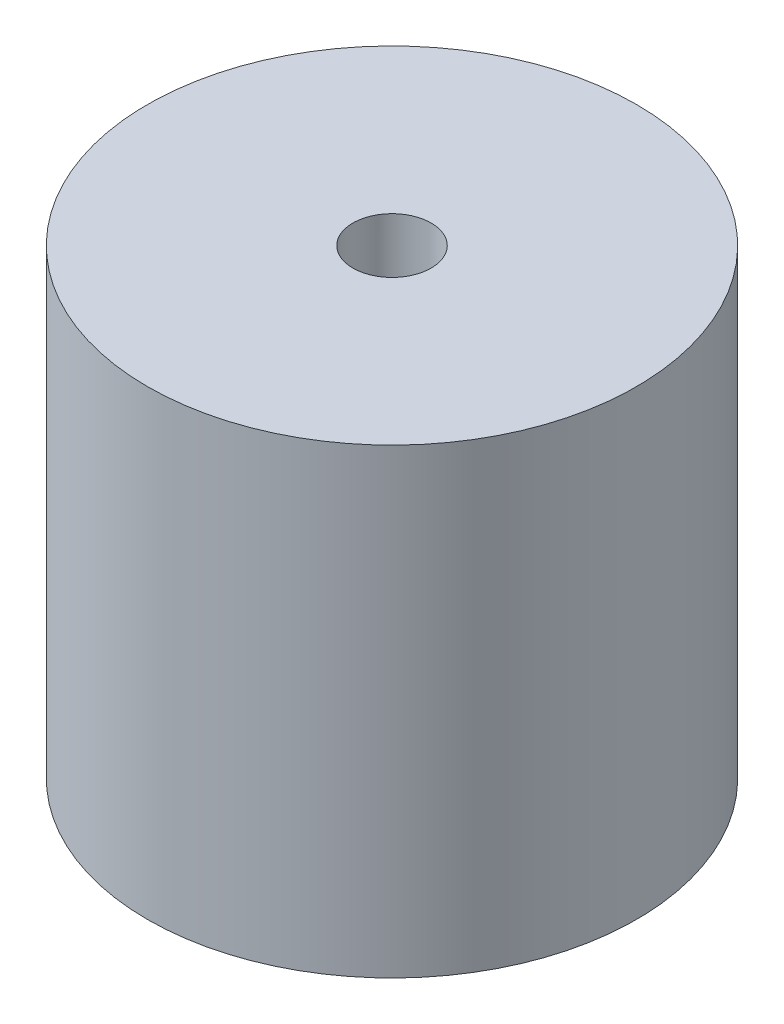
ISO-10303-21;
HEADER;
FILE_DESCRIPTION(('STEP AP214'),'2;1');
FILE_NAME('part.step','',(''),(''),'','','');
FILE_SCHEMA(('AUTOMOTIVE_DESIGN { 1 0 10303 214 1 1 1 1 }'));
ENDSEC;
DATA;
#1=APPLICATION_CONTEXT('core data for automotive mechanical design processes');
#2=APPLICATION_PROTOCOL_DEFINITION('international standard','automotive_design',2000,#1);
#3=PRODUCT_CONTEXT('',#1,'mechanical');
#4=PRODUCT('Part','Part','',(#3));
#5=PRODUCT_RELATED_PRODUCT_CATEGORY('part','',(#4));
#6=PRODUCT_DEFINITION_FORMATION('','',#4);
#7=PRODUCT_DEFINITION_CONTEXT('part definition',#1,'design');
#8=PRODUCT_DEFINITION('design','',#6,#7);
#9=PRODUCT_DEFINITION_SHAPE('','',#8);
#10=(LENGTH_UNIT() NAMED_UNIT(*) SI_UNIT(.MILLI.,.METRE.));
#11=(NAMED_UNIT(*) PLANE_ANGLE_UNIT() SI_UNIT($,.RADIAN.));
#12=(NAMED_UNIT(*) SI_UNIT($,.STERADIAN.) SOLID_ANGLE_UNIT());
#13=UNCERTAINTY_MEASURE_WITH_UNIT(LENGTH_MEASURE(1.E-05),#10,'distance_accuracy_value','');
#14=(GEOMETRIC_REPRESENTATION_CONTEXT(3) GLOBAL_UNCERTAINTY_ASSIGNED_CONTEXT((#13)) GLOBAL_UNIT_ASSIGNED_CONTEXT((#10,
#11,#12)) REPRESENTATION_CONTEXT('',''));
#15=CARTESIAN_POINT('',(0.,0.,0.));
#16=DIRECTION('',(0.,0.,1.));
#17=DIRECTION('',(1.,0.,0.));
#18=AXIS2_PLACEMENT_3D('',#15,#16,#17);
#19=CARTESIAN_POINT('',(0.,29.972,0.));
#20=DIRECTION('',(0.,-1.,0.));
#21=DIRECTION('',(0.,0.,-1.));
#22=AXIS2_PLACEMENT_3D('',#19,#20,#21);
#23=CYLINDRICAL_SURFACE('',#22,15.875);
#24=CARTESIAN_POINT('',(0.,29.972,0.));
#25=DIRECTION('',(0.,1.,0.));
#26=DIRECTION('',(0.,0.,1.));
#27=AXIS2_PLACEMENT_3D('',#24,#25,#26);
#28=CIRCLE('',#27,15.875);
#29=CARTESIAN_POINT('',(0.,29.972,15.875));
#30=VERTEX_POINT('',#29);
#31=EDGE_CURVE('E10',#30,#30,#28,.T.);
#32=ORIENTED_EDGE('',*,*,#31,.F.);
#33=EDGE_LOOP('',(#32));
#34=FACE_BOUND('',#33,.T.);
#35=CARTESIAN_POINT('',(0.,0.,0.));
#36=DIRECTION('',(0.,1.,0.));
#37=DIRECTION('',(0.,0.,1.));
#38=AXIS2_PLACEMENT_3D('',#35,#36,#37);
#39=CIRCLE('',#38,15.875);
#40=CARTESIAN_POINT('',(0.,0.,15.875));
#41=VERTEX_POINT('',#40);
#42=EDGE_CURVE('E34',#41,#41,#39,.T.);
#43=ORIENTED_EDGE('',*,*,#42,.T.);
#44=EDGE_LOOP('',(#43));
#45=FACE_BOUND('',#44,.T.);
#46=ADVANCED_FACE('F31',(#34,#45),#23,.T.);
#47=CARTESIAN_POINT('',(0.,29.972,0.));
#48=DIRECTION('',(0.,1.,0.));
#49=DIRECTION('',(0.,0.,1.));
#50=AXIS2_PLACEMENT_3D('',#47,#48,#49);
#51=PLANE('',#50);
#52=CARTESIAN_POINT('',(0.,29.972,0.));
#53=DIRECTION('',(0.,1.,0.));
#54=DIRECTION('',(0.,0.,1.));
#55=AXIS2_PLACEMENT_3D('',#52,#53,#54);
#56=CIRCLE('',#55,2.54);
#57=CARTESIAN_POINT('',(0.,29.972,2.54));
#58=VERTEX_POINT('',#57);
#59=EDGE_CURVE('E46',#58,#58,#56,.T.);
#60=ORIENTED_EDGE('',*,*,#59,.F.);
#61=EDGE_LOOP('',(#60));
#62=FACE_BOUND('',#61,.T.);
#63=ORIENTED_EDGE('',*,*,#31,.T.);
#64=EDGE_LOOP('',(#63));
#65=FACE_BOUND('',#64,.T.);
#66=ADVANCED_FACE('F57',(#62,#65),#51,.T.);
#67=CARTESIAN_POINT('',(0.,0.,0.));
#68=DIRECTION('',(0.,1.,0.));
#69=DIRECTION('',(0.,0.,1.));
#70=AXIS2_PLACEMENT_3D('',#67,#68,#69);
#71=PLANE('',#70);
#72=CARTESIAN_POINT('',(0.,0.,0.));
#73=DIRECTION('',(0.,-1.,0.));
#74=DIRECTION('',(0.,0.,-1.));
#75=AXIS2_PLACEMENT_3D('',#72,#73,#74);
#76=CIRCLE('',#75,12.065);
#77=CARTESIAN_POINT('',(0.,0.,-12.065));
#78=VERTEX_POINT('',#77);
#79=EDGE_CURVE('E43',#78,#78,#76,.T.);
#80=ORIENTED_EDGE('',*,*,#79,.F.);
#81=EDGE_LOOP('',(#80));
#82=FACE_BOUND('',#81,.T.);
#83=ORIENTED_EDGE('',*,*,#42,.F.);
#84=EDGE_LOOP('',(#83));
#85=FACE_BOUND('',#84,.T.);
#86=ADVANCED_FACE('F59',(#82,#85),#71,.F.);
#87=CARTESIAN_POINT('',(0.,24.13,0.));
#88=DIRECTION('',(0.,-1.,0.));
#89=DIRECTION('',(0.,0.,-1.));
#90=AXIS2_PLACEMENT_3D('',#87,#88,#89);
#91=CYLINDRICAL_SURFACE('',#90,12.065);
#92=CARTESIAN_POINT('',(0.,24.13,0.));
#93=DIRECTION('',(0.,-1.,0.));
#94=DIRECTION('',(0.,0.,-1.));
#95=AXIS2_PLACEMENT_3D('',#92,#93,#94);
#96=CIRCLE('',#95,12.065);
#97=CARTESIAN_POINT('',(0.,24.13,-12.065));
#98=VERTEX_POINT('',#97);
#99=EDGE_CURVE('E41',#98,#98,#96,.T.);
#100=CARTESIAN_POINT('',(0.,24.13,-12.065));
#101=CARTESIAN_POINT('',(0.,23.8786458333333,-12.065));
#102=CARTESIAN_POINT('',(0.,23.6272916666667,-12.065));
#103=CARTESIAN_POINT('',(0.,23.1245833333333,-12.065));
#104=CARTESIAN_POINT('',(0.,22.8732291666667,-12.065));
#105=CARTESIAN_POINT('',(0.,22.3705208333333,-12.065));
#106=CARTESIAN_POINT('',(0.,22.1191666666667,-12.065));
#107=CARTESIAN_POINT('',(0.,21.6164583333333,-12.065));
#108=CARTESIAN_POINT('',(0.,21.3651041666667,-12.065));
#109=CARTESIAN_POINT('',(0.,20.8623958333333,-12.065));
#110=CARTESIAN_POINT('',(0.,20.6110416666667,-12.065));
#111=CARTESIAN_POINT('',(0.,20.1083333333333,-12.065));
#112=CARTESIAN_POINT('',(0.,19.8569791666667,-12.065));
#113=CARTESIAN_POINT('',(0.,19.3542708333333,-12.065));
#114=CARTESIAN_POINT('',(0.,19.1029166666667,-12.065));
#115=CARTESIAN_POINT('',(0.,18.6002083333333,-12.065));
#116=CARTESIAN_POINT('',(0.,18.3488541666667,-12.065));
#117=CARTESIAN_POINT('',(0.,17.8461458333333,-12.065));
#118=CARTESIAN_POINT('',(0.,17.5947916666667,-12.065));
#119=CARTESIAN_POINT('',(0.,17.0920833333333,-12.065));
#120=CARTESIAN_POINT('',(0.,16.8407291666667,-12.065));
#121=CARTESIAN_POINT('',(0.,16.3380208333333,-12.065));
#122=CARTESIAN_POINT('',(0.,16.0866666666667,-12.065));
#123=CARTESIAN_POINT('',(0.,15.5839583333333,-12.065));
#124=CARTESIAN_POINT('',(0.,15.3326041666667,-12.065));
#125=CARTESIAN_POINT('',(0.,14.8298958333333,-12.065));
#126=CARTESIAN_POINT('',(0.,14.5785416666667,-12.065));
#127=CARTESIAN_POINT('',(0.,14.0758333333333,-12.065));
#128=CARTESIAN_POINT('',(0.,13.8244791666667,-12.065));
#129=CARTESIAN_POINT('',(0.,13.3217708333333,-12.065));
#130=CARTESIAN_POINT('',(0.,13.0704166666667,-12.065));
#131=CARTESIAN_POINT('',(0.,12.5677083333333,-12.065));
#132=CARTESIAN_POINT('',(0.,12.3163541666667,-12.065));
#133=CARTESIAN_POINT('',(0.,11.8136458333333,-12.065));
#134=CARTESIAN_POINT('',(0.,11.5622916666667,-12.065));
#135=CARTESIAN_POINT('',(0.,11.0595833333333,-12.065));
#136=CARTESIAN_POINT('',(0.,10.8082291666667,-12.065));
#137=CARTESIAN_POINT('',(0.,10.3055208333333,-12.065));
#138=CARTESIAN_POINT('',(0.,10.0541666666667,-12.065));
#139=CARTESIAN_POINT('',(0.,9.55145833333333,-12.065));
#140=CARTESIAN_POINT('',(0.,9.30010416666667,-12.065));
#141=CARTESIAN_POINT('',(0.,8.79739583333334,-12.065));
#142=CARTESIAN_POINT('',(0.,8.54604166666667,-12.065));
#143=CARTESIAN_POINT('',(0.,8.04333333333334,-12.065));
#144=CARTESIAN_POINT('',(0.,7.79197916666667,-12.065));
#145=CARTESIAN_POINT('',(0.,7.28927083333334,-12.065));
#146=CARTESIAN_POINT('',(0.,7.03791666666667,-12.065));
#147=CARTESIAN_POINT('',(0.,6.53520833333334,-12.065));
#148=CARTESIAN_POINT('',(0.,6.28385416666667,-12.065));
#149=CARTESIAN_POINT('',(0.,5.78114583333334,-12.065));
#150=CARTESIAN_POINT('',(0.,5.52979166666667,-12.065));
#151=CARTESIAN_POINT('',(0.,5.02708333333334,-12.065));
#152=CARTESIAN_POINT('',(0.,4.77572916666667,-12.065));
#153=CARTESIAN_POINT('',(0.,4.27302083333334,-12.065));
#154=CARTESIAN_POINT('',(0.,4.02166666666667,-12.065));
#155=CARTESIAN_POINT('',(0.,3.51895833333334,-12.065));
#156=CARTESIAN_POINT('',(0.,3.26760416666667,-12.065));
#157=CARTESIAN_POINT('',(0.,2.76489583333334,-12.065));
#158=CARTESIAN_POINT('',(0.,2.51354166666667,-12.065));
#159=CARTESIAN_POINT('',(0.,2.01083333333334,-12.065));
#160=CARTESIAN_POINT('',(0.,1.75947916666667,-12.065));
#161=CARTESIAN_POINT('',(0.,1.25677083333334,-12.065));
#162=CARTESIAN_POINT('',(0.,1.00541666666667,-12.065));
#163=CARTESIAN_POINT('',(0.,0.502708333333336,-12.065));
#164=CARTESIAN_POINT('',(0.,0.25135416666667,-12.065));
#165=CARTESIAN_POINT('',(0.,0.,-12.065));
#166=B_SPLINE_CURVE_WITH_KNOTS('',3,(#100,#101,#102,#103,#104,#105,#106,#107,#108,#109,#110,
#111,#112,#113,#114,#115,#116,#117,#118,#119,#120,#121,#122,#123,#124,#125,#126,#127,#128,#129,
#130,#131,#132,#133,#134,#135,#136,#137,#138,#139,#140,#141,#142,#143,#144,#145,#146,#147,#148,
#149,#150,#151,#152,#153,#154,#155,#156,#157,#158,#159,#160,#161,#162,#163,#164,#165),
.UNSPECIFIED.,.F.,.F.,(4,2,2,2,2,2,2,2,2,2,2,2,2,2,2,2,2,2,2,2,2,2,2,2,2,2,2,2,2,2,2,2,4),(0.,
0.754062500000003,1.508125,2.2621875,3.01625,3.7703125,4.524375,5.2784375,6.0325,6.7865625,
7.540625,8.2946875,9.04875,9.8028125,10.556875,11.3109375,12.065,12.8190625,13.573125,
14.3271875,15.08125,15.8353125,16.589375,17.3434375,18.0975,18.8515625,19.605625,20.3596875,
21.11375,21.8678125,22.621875,23.3759375,24.13),.UNSPECIFIED.);
#167=EDGE_CURVE('BSEAM65',#98,#78,#166,.T.);
#168=ORIENTED_EDGE('',*,*,#99,.F.);
#169=ORIENTED_EDGE('',*,*,#79,.T.);
#170=ORIENTED_EDGE('',*,*,#167,.T.);
#171=ORIENTED_EDGE('',*,*,#167,.F.);
#172=EDGE_LOOP('',(#168,#170,#169,#171));
#173=FACE_BOUND('',#172,.T.);
#174=ADVANCED_FACE('F65',(#173),#91,.F.);
#175=CARTESIAN_POINT('',(0.,24.13,0.));
#176=DIRECTION('',(0.,-1.,0.));
#177=DIRECTION('',(0.,0.,-1.));
#178=AXIS2_PLACEMENT_3D('',#175,#176,#177);
#179=PLANE('',#178);
#180=CARTESIAN_POINT('',(0.,24.13,0.));
#181=DIRECTION('',(0.,-1.,0.));
#182=DIRECTION('',(0.,0.,-1.));
#183=AXIS2_PLACEMENT_3D('',#180,#181,#182);
#184=CIRCLE('',#183,2.54);
#185=CARTESIAN_POINT('',(0.,24.13,-2.54));
#186=VERTEX_POINT('',#185);
#187=EDGE_CURVE('E49',#186,#186,#184,.F.);
#188=ORIENTED_EDGE('',*,*,#187,.T.);
#189=EDGE_LOOP('',(#188));
#190=FACE_BOUND('',#189,.T.);
#191=ORIENTED_EDGE('',*,*,#99,.T.);
#192=EDGE_LOOP('',(#191));
#193=FACE_BOUND('',#192,.T.);
#194=ADVANCED_FACE('F71',(#190,#193),#179,.T.);
#195=CARTESIAN_POINT('',(0.,-0.001000000000001,0.));
#196=DIRECTION('',(0.,1.,0.));
#197=DIRECTION('',(0.,0.,1.));
#198=AXIS2_PLACEMENT_3D('',#195,#196,#197);
#199=CYLINDRICAL_SURFACE('',#198,2.54);
#200=ORIENTED_EDGE('',*,*,#187,.F.);
#201=EDGE_LOOP('',(#200));
#202=FACE_BOUND('',#201,.T.);
#203=ORIENTED_EDGE('',*,*,#59,.T.);
#204=EDGE_LOOP('',(#203));
#205=FACE_BOUND('',#204,.T.);
#206=ADVANCED_FACE('F55',(#202,#205),#199,.F.);
#207=CLOSED_SHELL('',(#46,#66,#86,#174,#194,#206));
#208=MANIFOLD_SOLID_BREP('B2',#207);
#209=ADVANCED_BREP_SHAPE_REPRESENTATION('',(#18,#208),#14);
#210=SHAPE_DEFINITION_REPRESENTATION(#9,#209);
ENDSEC;
END-ISO-10303-21;
